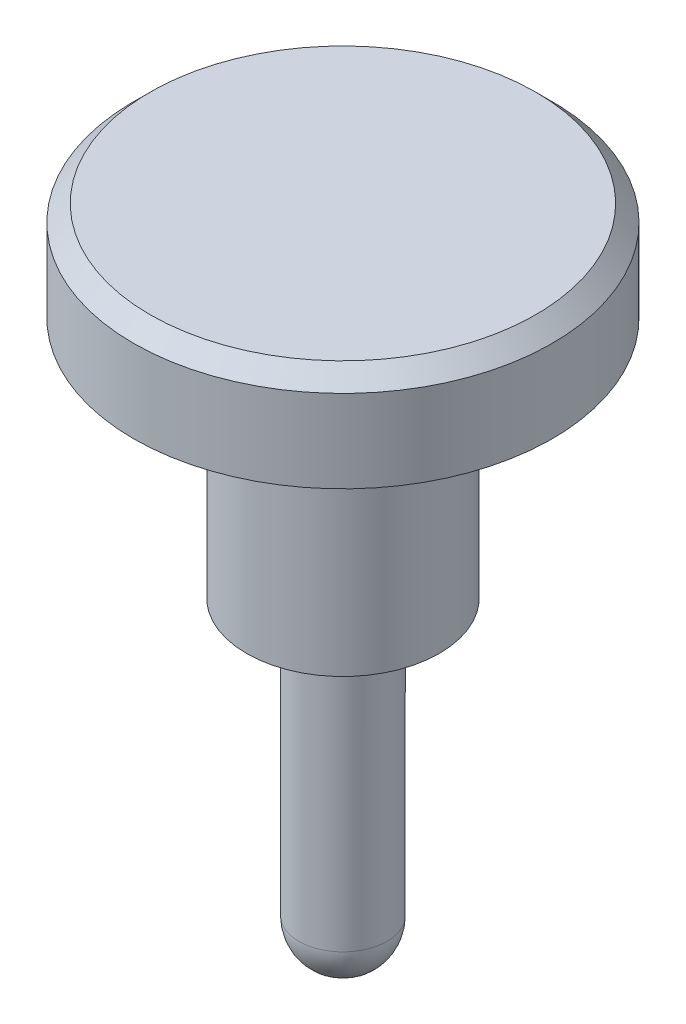
ISO-10303-21;
HEADER;
FILE_DESCRIPTION(('STEP AP214'),'2;1');
FILE_NAME('part.step','',(''),(''),'','','');
FILE_SCHEMA(('AUTOMOTIVE_DESIGN { 1 0 10303 214 1 1 1 1 }'));
ENDSEC;
DATA;
#1=APPLICATION_CONTEXT('core data for automotive mechanical design processes');
#2=APPLICATION_PROTOCOL_DEFINITION('international standard','automotive_design',2000,#1);
#3=PRODUCT_CONTEXT('',#1,'mechanical');
#4=PRODUCT('Part','Part','',(#3));
#5=PRODUCT_RELATED_PRODUCT_CATEGORY('part','',(#4));
#6=PRODUCT_DEFINITION_FORMATION('','',#4);
#7=PRODUCT_DEFINITION_CONTEXT('part definition',#1,'design');
#8=PRODUCT_DEFINITION('design','',#6,#7);
#9=PRODUCT_DEFINITION_SHAPE('','',#8);
#10=(LENGTH_UNIT() NAMED_UNIT(*) SI_UNIT(.MILLI.,.METRE.));
#11=(NAMED_UNIT(*) PLANE_ANGLE_UNIT() SI_UNIT($,.RADIAN.));
#12=(NAMED_UNIT(*) SI_UNIT($,.STERADIAN.) SOLID_ANGLE_UNIT());
#13=UNCERTAINTY_MEASURE_WITH_UNIT(LENGTH_MEASURE(1.E-05),#10,'distance_accuracy_value','');
#14=(GEOMETRIC_REPRESENTATION_CONTEXT(3) GLOBAL_UNCERTAINTY_ASSIGNED_CONTEXT((#13)) GLOBAL_UNIT_ASSIGNED_CONTEXT((#10,
#11,#12)) REPRESENTATION_CONTEXT('',''));
#15=CARTESIAN_POINT('',(0.,0.,0.));
#16=DIRECTION('',(0.,0.,1.));
#17=DIRECTION('',(1.,0.,0.));
#18=AXIS2_PLACEMENT_3D('',#15,#16,#17);
#19=CARTESIAN_POINT('',(0.,-94.,0.));
#20=DIRECTION('',(0.,1.,0.));
#21=DIRECTION('',(1.,0.,0.));
#22=AXIS2_PLACEMENT_3D('',#19,#20,#21);
#23=SPHERICAL_SURFACE('',#22,8.);
#24=CARTESIAN_POINT('',(0.,-94.,0.));
#25=DIRECTION('',(0.,1.,0.));
#26=DIRECTION('',(0.,0.,1.));
#27=AXIS2_PLACEMENT_3D('',#24,#25,#26);
#28=CIRCLE('',#27,8.);
#29=CARTESIAN_POINT('',(0.,-94.,8.));
#30=VERTEX_POINT('',#29);
#31=EDGE_CURVE('E10',#30,#30,#28,.T.);
#32=ORIENTED_EDGE('',*,*,#31,.F.);
#33=EDGE_LOOP('',(#32));
#34=FACE_BOUND('',#33,.T.);
#35=ADVANCED_FACE('F33',(#34),#23,.T.);
#36=CARTESIAN_POINT('',(0.,67.7179231258833,0.));
#37=DIRECTION('',(0.,1.,0.));
#38=DIRECTION('',(0.,0.,1.));
#39=AXIS2_PLACEMENT_3D('',#36,#37,#38);
#40=CYLINDRICAL_SURFACE('',#39,8.);
#41=CARTESIAN_POINT('',(0.,-44.,0.));
#42=DIRECTION('',(0.,1.,0.));
#43=DIRECTION('',(0.,0.,1.));
#44=AXIS2_PLACEMENT_3D('',#41,#42,#43);
#45=CIRCLE('',#44,8.);
#46=CARTESIAN_POINT('',(0.,-44.,8.));
#47=VERTEX_POINT('',#46);
#48=EDGE_CURVE('E39',#47,#47,#45,.T.);
#49=ORIENTED_EDGE('',*,*,#48,.F.);
#50=EDGE_LOOP('',(#49));
#51=FACE_BOUND('',#50,.T.);
#52=ORIENTED_EDGE('',*,*,#31,.T.);
#53=EDGE_LOOP('',(#52));
#54=FACE_BOUND('',#53,.T.);
#55=ADVANCED_FACE('F78',(#51,#54),#40,.T.);
#56=CARTESIAN_POINT('',(0.,-44.,0.));
#57=DIRECTION('',(0.,-1.,0.));
#58=DIRECTION('',(0.,0.,-1.));
#59=AXIS2_PLACEMENT_3D('',#56,#57,#58);
#60=PLANE('',#59);
#61=ORIENTED_EDGE('',*,*,#48,.T.);
#62=EDGE_LOOP('',(#61));
#63=FACE_BOUND('',#62,.T.);
#64=CARTESIAN_POINT('',(0.,-44.,0.));
#65=DIRECTION('',(0.,1.,0.));
#66=DIRECTION('',(0.,0.,1.));
#67=AXIS2_PLACEMENT_3D('',#64,#65,#66);
#68=CIRCLE('',#67,17.5);
#69=CARTESIAN_POINT('',(0.,-44.,17.5));
#70=VERTEX_POINT('',#69);
#71=EDGE_CURVE('E43',#70,#70,#68,.T.);
#72=ORIENTED_EDGE('',*,*,#71,.F.);
#73=EDGE_LOOP('',(#72));
#74=FACE_BOUND('',#73,.T.);
#75=ADVANCED_FACE('F83',(#63,#74),#60,.T.);
#76=CARTESIAN_POINT('',(0.,67.7179231258833,0.));
#77=DIRECTION('',(0.,1.,0.));
#78=DIRECTION('',(0.,0.,1.));
#79=AXIS2_PLACEMENT_3D('',#76,#77,#78);
#80=CYLINDRICAL_SURFACE('',#79,17.5);
#81=ORIENTED_EDGE('',*,*,#71,.T.);
#82=EDGE_LOOP('',(#81));
#83=FACE_BOUND('',#82,.T.);
#84=CARTESIAN_POINT('',(0.,0.,0.));
#85=DIRECTION('',(0.,1.,0.));
#86=DIRECTION('',(0.,0.,1.));
#87=AXIS2_PLACEMENT_3D('',#84,#85,#86);
#88=CIRCLE('',#87,17.5);
#89=CARTESIAN_POINT('',(0.,0.,17.5));
#90=VERTEX_POINT('',#89);
#91=EDGE_CURVE('E47',#90,#90,#88,.T.);
#92=ORIENTED_EDGE('',*,*,#91,.F.);
#93=EDGE_LOOP('',(#92));
#94=FACE_BOUND('',#93,.T.);
#95=ADVANCED_FACE('F88',(#83,#94),#80,.T.);
#96=CARTESIAN_POINT('',(0.,0.,0.));
#97=DIRECTION('',(0.,-1.,0.));
#98=DIRECTION('',(0.,0.,-1.));
#99=AXIS2_PLACEMENT_3D('',#96,#97,#98);
#100=PLANE('',#99);
#101=ORIENTED_EDGE('',*,*,#91,.T.);
#102=EDGE_LOOP('',(#101));
#103=FACE_BOUND('',#102,.T.);
#104=CARTESIAN_POINT('',(0.,0.,0.));
#105=DIRECTION('',(0.,1.,0.));
#106=DIRECTION('',(0.,0.,1.));
#107=AXIS2_PLACEMENT_3D('',#104,#105,#106);
#108=CIRCLE('',#107,38.);
#109=CARTESIAN_POINT('',(0.,0.,38.));
#110=VERTEX_POINT('',#109);
#111=EDGE_CURVE('E52',#110,#110,#108,.T.);
#112=ORIENTED_EDGE('',*,*,#111,.F.);
#113=EDGE_LOOP('',(#112));
#114=FACE_BOUND('',#113,.T.);
#115=ADVANCED_FACE('F74',(#103,#114),#100,.T.);
#116=CARTESIAN_POINT('',(0.,67.7179231258833,0.));
#117=DIRECTION('',(0.,1.,0.));
#118=DIRECTION('',(0.,0.,1.));
#119=AXIS2_PLACEMENT_3D('',#116,#117,#118);
#120=CYLINDRICAL_SURFACE('',#119,38.);
#121=ORIENTED_EDGE('',*,*,#111,.T.);
#122=EDGE_LOOP('',(#121));
#123=FACE_BOUND('',#122,.T.);
#124=CARTESIAN_POINT('',(0.,15.,0.));
#125=DIRECTION('',(0.,1.,0.));
#126=DIRECTION('',(0.,0.,1.));
#127=AXIS2_PLACEMENT_3D('',#124,#125,#126);
#128=CIRCLE('',#127,38.);
#129=CARTESIAN_POINT('',(0.,15.,38.));
#130=VERTEX_POINT('',#129);
#131=EDGE_CURVE('E55',#130,#130,#128,.T.);
#132=ORIENTED_EDGE('',*,*,#131,.F.);
#133=EDGE_LOOP('',(#132));
#134=FACE_BOUND('',#133,.T.);
#135=ADVANCED_FACE('F66',(#123,#134),#120,.T.);
#136=CARTESIAN_POINT('',(0.,18.,0.));
#137=DIRECTION('',(0.,-1.,0.));
#138=DIRECTION('',(0.,0.,-1.));
#139=AXIS2_PLACEMENT_3D('',#136,#137,#138);
#140=CONICAL_SURFACE('',#139,35.,0.785398163397448);
#141=ORIENTED_EDGE('',*,*,#131,.T.);
#142=EDGE_LOOP('',(#141));
#143=FACE_BOUND('',#142,.T.);
#144=CARTESIAN_POINT('',(0.,18.,0.));
#145=DIRECTION('',(0.,1.,0.));
#146=DIRECTION('',(0.,0.,1.));
#147=AXIS2_PLACEMENT_3D('',#144,#145,#146);
#148=CIRCLE('',#147,35.);
#149=CARTESIAN_POINT('',(0.,18.,35.));
#150=VERTEX_POINT('',#149);
#151=EDGE_CURVE('E58',#150,#150,#148,.T.);
#152=ORIENTED_EDGE('',*,*,#151,.F.);
#153=EDGE_LOOP('',(#152));
#154=FACE_BOUND('',#153,.T.);
#155=ADVANCED_FACE('F64',(#143,#154),#140,.T.);
#156=CARTESIAN_POINT('',(0.,18.,0.));
#157=DIRECTION('',(0.,1.,0.));
#158=DIRECTION('',(0.,0.,1.));
#159=AXIS2_PLACEMENT_3D('',#156,#157,#158);
#160=PLANE('',#159);
#161=ORIENTED_EDGE('',*,*,#151,.T.);
#162=EDGE_LOOP('',(#161));
#163=FACE_BOUND('',#162,.T.);
#164=ADVANCED_FACE('F62',(#163),#160,.T.);
#165=CLOSED_SHELL('',(#35,#55,#75,#95,#115,#135,#155,#164));
#166=MANIFOLD_SOLID_BREP('B2',#165);
#167=ADVANCED_BREP_SHAPE_REPRESENTATION('',(#18,#166),#14);
#168=SHAPE_DEFINITION_REPRESENTATION(#9,#167);
ENDSEC;
END-ISO-10303-21;
